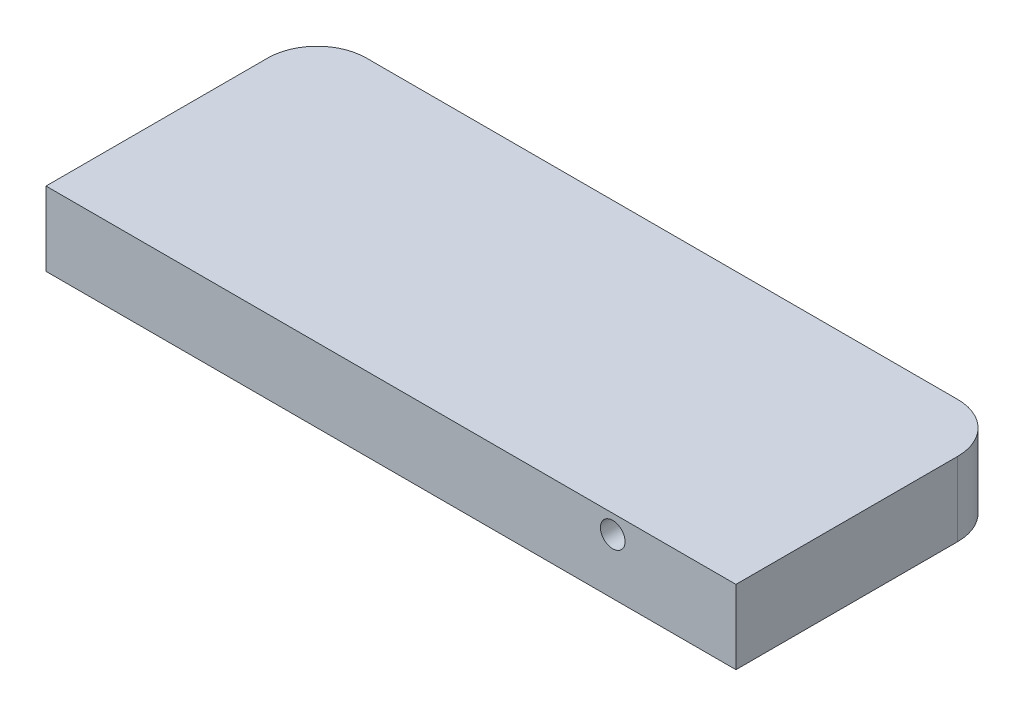
ISO-10303-21;
HEADER;
FILE_DESCRIPTION(('STEP AP214'),'2;1');
FILE_NAME('part.step','',(''),(''),'','','');
FILE_SCHEMA(('AUTOMOTIVE_DESIGN { 1 0 10303 214 1 1 1 1 }'));
ENDSEC;
DATA;
#1=APPLICATION_CONTEXT('core data for automotive mechanical design processes');
#2=APPLICATION_PROTOCOL_DEFINITION('international standard','automotive_design',2000,#1);
#3=PRODUCT_CONTEXT('',#1,'mechanical');
#4=PRODUCT('Part','Part','',(#3));
#5=PRODUCT_RELATED_PRODUCT_CATEGORY('part','',(#4));
#6=PRODUCT_DEFINITION_FORMATION('','',#4);
#7=PRODUCT_DEFINITION_CONTEXT('part definition',#1,'design');
#8=PRODUCT_DEFINITION('design','',#6,#7);
#9=PRODUCT_DEFINITION_SHAPE('','',#8);
#10=(LENGTH_UNIT() NAMED_UNIT(*) SI_UNIT(.MILLI.,.METRE.));
#11=(NAMED_UNIT(*) PLANE_ANGLE_UNIT() SI_UNIT($,.RADIAN.));
#12=(NAMED_UNIT(*) SI_UNIT($,.STERADIAN.) SOLID_ANGLE_UNIT());
#13=UNCERTAINTY_MEASURE_WITH_UNIT(LENGTH_MEASURE(1.E-05),#10,'distance_accuracy_value','');
#14=(GEOMETRIC_REPRESENTATION_CONTEXT(3) GLOBAL_UNCERTAINTY_ASSIGNED_CONTEXT((#13)) GLOBAL_UNIT_ASSIGNED_CONTEXT((#10,
#11,#12)) REPRESENTATION_CONTEXT('',''));
#15=CARTESIAN_POINT('',(0.,0.,0.));
#16=DIRECTION('',(0.,0.,1.));
#17=DIRECTION('',(1.,0.,0.));
#18=AXIS2_PLACEMENT_3D('',#15,#16,#17);
#19=CARTESIAN_POINT('',(0.,-30.,0.));
#20=DIRECTION('',(-1.,0.,0.));
#21=DIRECTION('',(0.,0.,1.));
#22=AXIS2_PLACEMENT_3D('',#19,#20,#21);
#23=PLANE('',#22);
#24=DIRECTION('',(0.,0.,1.));
#25=VECTOR('',#24,1.);
#26=CARTESIAN_POINT('',(0.,0.,0.));
#27=LINE('',#26,#25);
#28=CARTESIAN_POINT('',(0.,0.,-89.9999999999998));
#29=VERTEX_POINT('',#28);
#30=CARTESIAN_POINT('',(0.,0.,0.));
#31=VERTEX_POINT('',#30);
#32=EDGE_CURVE('E131',#29,#31,#27,.T.);
#33=ORIENTED_EDGE('',*,*,#32,.F.);
#34=DIRECTION('',(0.,1.,0.));
#35=VECTOR('',#34,1.);
#36=CARTESIAN_POINT('',(0.,-30.,-89.9999999999998));
#37=LINE('',#36,#35);
#38=CARTESIAN_POINT('',(0.,-30.,-89.9999999999998));
#39=VERTEX_POINT('',#38);
#40=EDGE_CURVE('E11',#39,#29,#37,.T.);
#41=ORIENTED_EDGE('',*,*,#40,.F.);
#42=DIRECTION('',(0.,0.,1.));
#43=VECTOR('',#42,1.);
#44=CARTESIAN_POINT('',(0.,-30.,0.));
#45=LINE('',#44,#43);
#46=CARTESIAN_POINT('',(0.,-30.,0.));
#47=VERTEX_POINT('',#46);
#48=EDGE_CURVE('E152',#39,#47,#45,.T.);
#49=ORIENTED_EDGE('',*,*,#48,.T.);
#50=DIRECTION('',(0.,1.,0.));
#51=VECTOR('',#50,1.);
#52=CARTESIAN_POINT('',(0.,-30.,0.));
#53=LINE('',#52,#51);
#54=EDGE_CURVE('E43',#47,#31,#53,.T.);
#55=ORIENTED_EDGE('',*,*,#54,.T.);
#56=EDGE_LOOP('',(#33,#41,#49,#55));
#57=FACE_BOUND('',#56,.T.);
#58=ADVANCED_FACE('F40',(#57),#23,.T.);
#59=CARTESIAN_POINT('',(20.,-30.,-90.));
#60=DIRECTION('',(0.,1.,0.));
#61=DIRECTION('',(0.,0.,1.));
#62=AXIS2_PLACEMENT_3D('',#59,#60,#61);
#63=CYLINDRICAL_SURFACE('',#62,20.);
#64=CARTESIAN_POINT('',(20.,0.,-90.));
#65=DIRECTION('',(0.,1.,0.));
#66=DIRECTION('',(0.,0.,-1.));
#67=AXIS2_PLACEMENT_3D('',#64,#65,#66);
#68=CIRCLE('',#67,20.);
#69=CARTESIAN_POINT('',(20.0000000000001,0.,-110.));
#70=VERTEX_POINT('',#69);
#71=EDGE_CURVE('E149',#70,#29,#68,.T.);
#72=ORIENTED_EDGE('',*,*,#71,.F.);
#73=DIRECTION('',(0.,1.,0.));
#74=VECTOR('',#73,1.);
#75=CARTESIAN_POINT('',(20.0000000000001,-30.,-110.));
#76=LINE('',#75,#74);
#77=CARTESIAN_POINT('',(20.0000000000001,-30.,-110.));
#78=VERTEX_POINT('',#77);
#79=EDGE_CURVE('E50',#78,#70,#76,.T.);
#80=ORIENTED_EDGE('',*,*,#79,.F.);
#81=CARTESIAN_POINT('',(20.,-30.,-90.));
#82=DIRECTION('',(0.,1.,0.));
#83=DIRECTION('',(0.,0.,-1.));
#84=AXIS2_PLACEMENT_3D('',#81,#82,#83);
#85=CIRCLE('',#84,20.);
#86=EDGE_CURVE('E117',#78,#39,#85,.T.);
#87=ORIENTED_EDGE('',*,*,#86,.T.);
#88=ORIENTED_EDGE('',*,*,#40,.T.);
#89=EDGE_LOOP('',(#72,#80,#87,#88));
#90=FACE_BOUND('',#89,.T.);
#91=ADVANCED_FACE('F164',(#90),#63,.T.);
#92=CARTESIAN_POINT('',(20.0000000000001,-30.,-110.));
#93=DIRECTION('',(0.,0.,-1.));
#94=DIRECTION('',(-1.,0.,0.));
#95=AXIS2_PLACEMENT_3D('',#92,#93,#94);
#96=PLANE('',#95);
#97=DIRECTION('',(-1.,0.,0.));
#98=VECTOR('',#97,1.);
#99=CARTESIAN_POINT('',(20.0000000000001,0.,-110.));
#100=LINE('',#99,#98);
#101=CARTESIAN_POINT('',(260.,0.,-110.));
#102=VERTEX_POINT('',#101);
#103=EDGE_CURVE('E103',#102,#70,#100,.T.);
#104=ORIENTED_EDGE('',*,*,#103,.F.);
#105=DIRECTION('',(0.,1.,0.));
#106=VECTOR('',#105,1.);
#107=CARTESIAN_POINT('',(260.,-30.,-110.));
#108=LINE('',#107,#106);
#109=CARTESIAN_POINT('',(260.,-30.,-110.));
#110=VERTEX_POINT('',#109);
#111=EDGE_CURVE('E98',#110,#102,#108,.T.);
#112=ORIENTED_EDGE('',*,*,#111,.F.);
#113=DIRECTION('',(-1.,0.,0.));
#114=VECTOR('',#113,1.);
#115=CARTESIAN_POINT('',(20.0000000000001,-30.,-110.));
#116=LINE('',#115,#114);
#117=EDGE_CURVE('E101',#110,#78,#116,.T.);
#118=ORIENTED_EDGE('',*,*,#117,.T.);
#119=ORIENTED_EDGE('',*,*,#79,.T.);
#120=EDGE_LOOP('',(#104,#112,#118,#119));
#121=FACE_BOUND('',#120,.T.);
#122=ADVANCED_FACE('F100',(#121),#96,.T.);
#123=CARTESIAN_POINT('',(260.,-30.,-90.));
#124=DIRECTION('',(0.,1.,0.));
#125=DIRECTION('',(0.,0.,1.));
#126=AXIS2_PLACEMENT_3D('',#123,#124,#125);
#127=CYLINDRICAL_SURFACE('',#126,20.);
#128=CARTESIAN_POINT('',(260.,0.,-90.));
#129=DIRECTION('',(0.,1.,0.));
#130=DIRECTION('',(0.,0.,-1.));
#131=AXIS2_PLACEMENT_3D('',#128,#129,#130);
#132=CIRCLE('',#131,20.);
#133=CARTESIAN_POINT('',(280.,0.,-90.));
#134=VERTEX_POINT('',#133);
#135=EDGE_CURVE('E144',#134,#102,#132,.T.);
#136=ORIENTED_EDGE('',*,*,#135,.F.);
#137=DIRECTION('',(0.,1.,0.));
#138=VECTOR('',#137,1.);
#139=CARTESIAN_POINT('',(280.,-30.,-90.));
#140=LINE('',#139,#138);
#141=CARTESIAN_POINT('',(280.,-30.,-90.));
#142=VERTEX_POINT('',#141);
#143=EDGE_CURVE('E109',#142,#134,#140,.T.);
#144=ORIENTED_EDGE('',*,*,#143,.F.);
#145=CARTESIAN_POINT('',(260.,-30.,-90.));
#146=DIRECTION('',(0.,1.,0.));
#147=DIRECTION('',(0.,0.,-1.));
#148=AXIS2_PLACEMENT_3D('',#145,#146,#147);
#149=CIRCLE('',#148,20.);
#150=EDGE_CURVE('E115',#142,#110,#149,.T.);
#151=ORIENTED_EDGE('',*,*,#150,.T.);
#152=ORIENTED_EDGE('',*,*,#111,.T.);
#153=EDGE_LOOP('',(#136,#144,#151,#152));
#154=FACE_BOUND('',#153,.T.);
#155=ADVANCED_FACE('F120',(#154),#127,.T.);
#156=CARTESIAN_POINT('',(280.,-30.,0.));
#157=DIRECTION('',(1.,0.,0.));
#158=DIRECTION('',(0.,0.,-1.));
#159=AXIS2_PLACEMENT_3D('',#156,#157,#158);
#160=PLANE('',#159);
#161=DIRECTION('',(0.,0.,-1.));
#162=VECTOR('',#161,1.);
#163=CARTESIAN_POINT('',(280.,0.,0.));
#164=LINE('',#163,#162);
#165=CARTESIAN_POINT('',(280.,0.,0.));
#166=VERTEX_POINT('',#165);
#167=EDGE_CURVE('E140',#166,#134,#164,.T.);
#168=ORIENTED_EDGE('',*,*,#167,.F.);
#169=DIRECTION('',(0.,1.,0.));
#170=VECTOR('',#169,1.);
#171=CARTESIAN_POINT('',(280.,-30.,0.));
#172=LINE('',#171,#170);
#173=CARTESIAN_POINT('',(280.,-30.,0.));
#174=VERTEX_POINT('',#173);
#175=EDGE_CURVE('E157',#174,#166,#172,.T.);
#176=ORIENTED_EDGE('',*,*,#175,.F.);
#177=DIRECTION('',(0.,0.,-1.));
#178=VECTOR('',#177,1.);
#179=CARTESIAN_POINT('',(280.,-30.,0.));
#180=LINE('',#179,#178);
#181=EDGE_CURVE('E122',#174,#142,#180,.T.);
#182=ORIENTED_EDGE('',*,*,#181,.T.);
#183=ORIENTED_EDGE('',*,*,#143,.T.);
#184=EDGE_LOOP('',(#168,#176,#182,#183));
#185=FACE_BOUND('',#184,.T.);
#186=ADVANCED_FACE('F177',(#185),#160,.T.);
#187=CARTESIAN_POINT('',(0.,-30.,0.));
#188=DIRECTION('',(0.,0.,1.));
#189=DIRECTION('',(1.,0.,0.));
#190=AXIS2_PLACEMENT_3D('',#187,#188,#189);
#191=PLANE('',#190);
#192=CARTESIAN_POINT('',(230.,-7.5,0.));
#193=DIRECTION('',(0.,0.,1.));
#194=DIRECTION('',(1.,0.,0.));
#195=AXIS2_PLACEMENT_3D('',#192,#193,#194);
#196=CIRCLE('',#195,4.99999999999999);
#197=CARTESIAN_POINT('',(235.,-7.5,0.));
#198=VERTEX_POINT('',#197);
#199=EDGE_CURVE('E189',#198,#198,#196,.T.);
#200=ORIENTED_EDGE('',*,*,#199,.F.);
#201=EDGE_LOOP('',(#200));
#202=FACE_BOUND('',#201,.T.);
#203=DIRECTION('',(1.,0.,0.));
#204=VECTOR('',#203,1.);
#205=CARTESIAN_POINT('',(0.,0.,0.));
#206=LINE('',#205,#204);
#207=EDGE_CURVE('E135',#31,#166,#206,.T.);
#208=ORIENTED_EDGE('',*,*,#207,.F.);
#209=ORIENTED_EDGE('',*,*,#54,.F.);
#210=DIRECTION('',(1.,0.,0.));
#211=VECTOR('',#210,1.);
#212=CARTESIAN_POINT('',(0.,-30.,0.));
#213=LINE('',#212,#211);
#214=EDGE_CURVE('E125',#47,#174,#213,.T.);
#215=ORIENTED_EDGE('',*,*,#214,.T.);
#216=ORIENTED_EDGE('',*,*,#175,.T.);
#217=EDGE_LOOP('',(#208,#209,#215,#216));
#218=FACE_BOUND('',#217,.T.);
#219=ADVANCED_FACE('F161',(#202,#218),#191,.T.);
#220=CARTESIAN_POINT('',(20.,-30.,-90.));
#221=DIRECTION('',(0.,-1.,0.));
#222=DIRECTION('',(0.,0.,-1.));
#223=AXIS2_PLACEMENT_3D('',#220,#221,#222);
#224=PLANE('',#223);
#225=ORIENTED_EDGE('',*,*,#48,.F.);
#226=ORIENTED_EDGE('',*,*,#86,.F.);
#227=ORIENTED_EDGE('',*,*,#117,.F.);
#228=ORIENTED_EDGE('',*,*,#150,.F.);
#229=ORIENTED_EDGE('',*,*,#181,.F.);
#230=ORIENTED_EDGE('',*,*,#214,.F.);
#231=EDGE_LOOP('',(#225,#226,#227,#228,#229,#230));
#232=FACE_BOUND('',#231,.T.);
#233=ADVANCED_FACE('F113',(#232),#224,.T.);
#234=CARTESIAN_POINT('',(20.,0.,-90.));
#235=DIRECTION('',(0.,-1.,0.));
#236=DIRECTION('',(0.,0.,-1.));
#237=AXIS2_PLACEMENT_3D('',#234,#235,#236);
#238=PLANE('',#237);
#239=ORIENTED_EDGE('',*,*,#32,.T.);
#240=ORIENTED_EDGE('',*,*,#207,.T.);
#241=ORIENTED_EDGE('',*,*,#167,.T.);
#242=ORIENTED_EDGE('',*,*,#135,.T.);
#243=ORIENTED_EDGE('',*,*,#103,.T.);
#244=ORIENTED_EDGE('',*,*,#71,.T.);
#245=EDGE_LOOP('',(#239,#240,#241,#242,#243,#244));
#246=FACE_BOUND('',#245,.T.);
#247=ADVANCED_FACE('F163',(#246),#238,.F.);
#248=CARTESIAN_POINT('',(230.,-7.5,-58.));
#249=DIRECTION('',(0.,0.,1.));
#250=DIRECTION('',(1.,0.,0.));
#251=AXIS2_PLACEMENT_3D('',#248,#249,#250);
#252=CYLINDRICAL_SURFACE('',#251,4.99999999999999);
#253=CARTESIAN_POINT('',(230.,-7.5,-58.));
#254=DIRECTION('',(0.,0.,1.));
#255=DIRECTION('',(1.,0.,0.));
#256=AXIS2_PLACEMENT_3D('',#253,#254,#255);
#257=CIRCLE('',#256,4.99999999999999);
#258=CARTESIAN_POINT('',(235.,-7.5,-58.));
#259=VERTEX_POINT('',#258);
#260=EDGE_CURVE('E136',#259,#259,#257,.T.);
#261=ORIENTED_EDGE('',*,*,#260,.F.);
#262=EDGE_LOOP('',(#261));
#263=FACE_BOUND('',#262,.T.);
#264=ORIENTED_EDGE('',*,*,#199,.T.);
#265=EDGE_LOOP('',(#264));
#266=FACE_BOUND('',#265,.T.);
#267=ADVANCED_FACE('F203',(#263,#266),#252,.F.);
#268=CARTESIAN_POINT('',(230.,-7.5,-58.));
#269=DIRECTION('',(0.,0.,1.));
#270=DIRECTION('',(1.,0.,0.));
#271=AXIS2_PLACEMENT_3D('',#268,#269,#270);
#272=PLANE('',#271);
#273=ORIENTED_EDGE('',*,*,#260,.T.);
#274=EDGE_LOOP('',(#273));
#275=FACE_BOUND('',#274,.T.);
#276=ADVANCED_FACE('F201',(#275),#272,.T.);
#277=CLOSED_SHELL('',(#58,#91,#122,#155,#186,#219,#233,#247,#267,#276));
#278=MANIFOLD_SOLID_BREP('B2',#277);
#279=ADVANCED_BREP_SHAPE_REPRESENTATION('',(#18,#278),#14);
#280=SHAPE_DEFINITION_REPRESENTATION(#9,#279);
ENDSEC;
END-ISO-10303-21;
